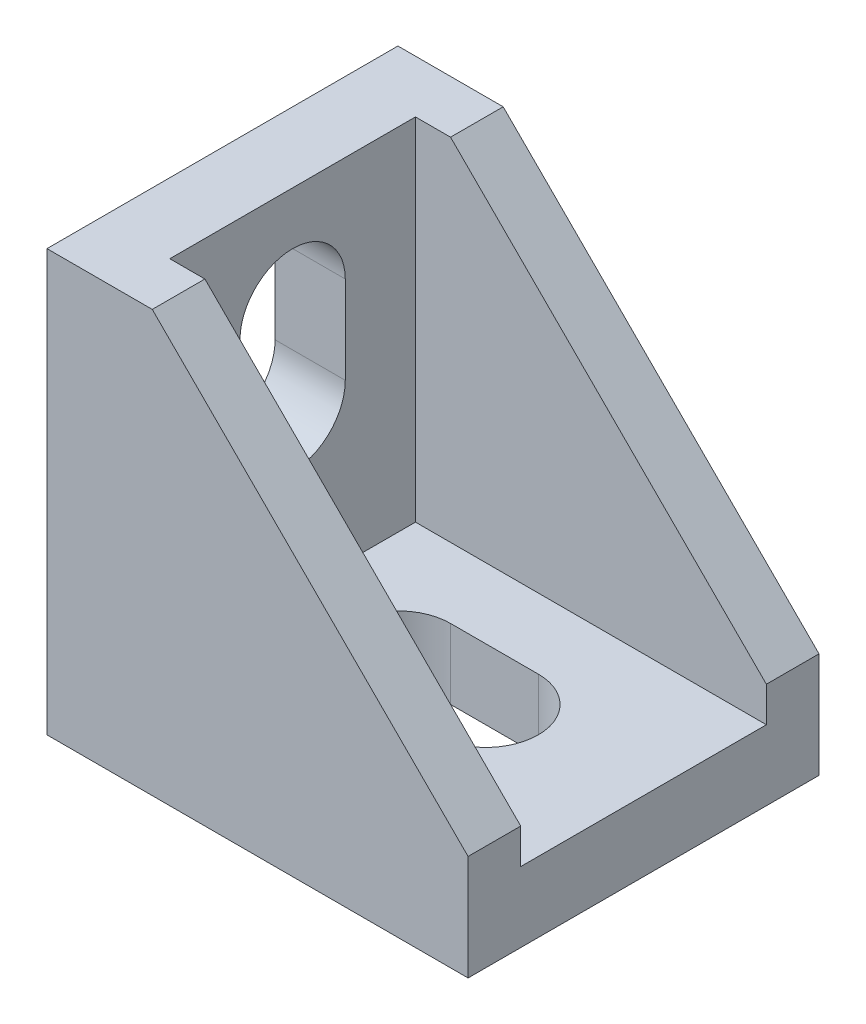
ISO-10303-21;
HEADER;
FILE_DESCRIPTION(('STEP AP214'),'2;1');
FILE_NAME('part.step','',(''),(''),'','','');
FILE_SCHEMA(('AUTOMOTIVE_DESIGN { 1 0 10303 214 1 1 1 1 }'));
ENDSEC;
DATA;
#1=APPLICATION_CONTEXT('core data for automotive mechanical design processes');
#2=APPLICATION_PROTOCOL_DEFINITION('international standard','automotive_design',2000,#1);
#3=PRODUCT_CONTEXT('',#1,'mechanical');
#4=PRODUCT('Part','Part','',(#3));
#5=PRODUCT_RELATED_PRODUCT_CATEGORY('part','',(#4));
#6=PRODUCT_DEFINITION_FORMATION('','',#4);
#7=PRODUCT_DEFINITION_CONTEXT('part definition',#1,'design');
#8=PRODUCT_DEFINITION('design','',#6,#7);
#9=PRODUCT_DEFINITION_SHAPE('','',#8);
#10=(LENGTH_UNIT() NAMED_UNIT(*) SI_UNIT(.MILLI.,.METRE.));
#11=(NAMED_UNIT(*) PLANE_ANGLE_UNIT() SI_UNIT($,.RADIAN.));
#12=(NAMED_UNIT(*) SI_UNIT($,.STERADIAN.) SOLID_ANGLE_UNIT());
#13=UNCERTAINTY_MEASURE_WITH_UNIT(LENGTH_MEASURE(1.E-05),#10,'distance_accuracy_value','');
#14=(GEOMETRIC_REPRESENTATION_CONTEXT(3) GLOBAL_UNCERTAINTY_ASSIGNED_CONTEXT((#13)) GLOBAL_UNIT_ASSIGNED_CONTEXT((#10,
#11,#12)) REPRESENTATION_CONTEXT('',''));
#15=CARTESIAN_POINT('',(0.,0.,0.));
#16=DIRECTION('',(0.,0.,1.));
#17=DIRECTION('',(1.,0.,0.));
#18=AXIS2_PLACEMENT_3D('',#15,#16,#17);
#19=CARTESIAN_POINT('',(24.,6.,20.));
#20=DIRECTION('',(-0.707106781186548,-0.707106781186548,0.));
#21=DIRECTION('',(0.707106781186548,-0.707106781186548,0.));
#22=AXIS2_PLACEMENT_3D('',#19,#20,#21);
#23=PLANE('',#22);
#24=DIRECTION('',(-0.707106781186548,0.707106781186548,0.));
#25=VECTOR('',#24,1.);
#26=CARTESIAN_POINT('',(24.,6.,3.));
#27=LINE('',#26,#25);
#28=CARTESIAN_POINT('',(24.,6.,3.));
#29=VERTEX_POINT('',#28);
#30=CARTESIAN_POINT('',(6.,24.,3.));
#31=VERTEX_POINT('',#30);
#32=EDGE_CURVE('E178',#29,#31,#27,.T.);
#33=ORIENTED_EDGE('',*,*,#32,.F.);
#34=DIRECTION('',(0.,0.,-1.));
#35=VECTOR('',#34,1.);
#36=CARTESIAN_POINT('',(24.,6.,20.));
#37=LINE('',#36,#35);
#38=CARTESIAN_POINT('',(24.,6.,0.));
#39=VERTEX_POINT('',#38);
#40=EDGE_CURVE('E164',#29,#39,#37,.T.);
#41=ORIENTED_EDGE('',*,*,#40,.T.);
#42=DIRECTION('',(-0.707106781186547,0.707106781186547,0.));
#43=VECTOR('',#42,1.);
#44=CARTESIAN_POINT('',(24.,6.,0.));
#45=LINE('',#44,#43);
#46=CARTESIAN_POINT('',(6.,24.,0.));
#47=VERTEX_POINT('',#46);
#48=EDGE_CURVE('E176',#39,#47,#45,.T.);
#49=ORIENTED_EDGE('',*,*,#48,.T.);
#50=DIRECTION('',(0.,0.,-1.));
#51=VECTOR('',#50,1.);
#52=CARTESIAN_POINT('',(6.,24.,20.));
#53=LINE('',#52,#51);
#54=EDGE_CURVE('E195',#31,#47,#53,.T.);
#55=ORIENTED_EDGE('',*,*,#54,.F.);
#56=EDGE_LOOP('',(#33,#41,#49,#55));
#57=FACE_BOUND('',#56,.T.);
#58=ADVANCED_FACE('F39',(#57),#23,.F.);
#59=CARTESIAN_POINT('',(0.,28.,20.));
#60=DIRECTION('',(1.,0.,0.));
#61=DIRECTION('',(0.,1.,0.));
#62=AXIS2_PLACEMENT_3D('',#59,#60,#61);
#63=PLANE('',#62);
#64=DIRECTION('',(0.,1.,0.));
#65=VECTOR('',#64,1.);
#66=CARTESIAN_POINT('',(0.,28.,7.));
#67=LINE('',#66,#65);
#68=CARTESIAN_POINT('',(0.,13.,7.));
#69=VERTEX_POINT('',#68);
#70=CARTESIAN_POINT('',(0.,18.,7.));
#71=VERTEX_POINT('',#70);
#72=EDGE_CURVE('E283',#69,#71,#67,.T.);
#73=ORIENTED_EDGE('',*,*,#72,.T.);
#74=CARTESIAN_POINT('',(0.,18.,10.));
#75=DIRECTION('',(1.,0.,0.));
#76=DIRECTION('',(0.,1.,0.));
#77=AXIS2_PLACEMENT_3D('',#74,#75,#76);
#78=CIRCLE('',#77,3.);
#79=CARTESIAN_POINT('',(0.,18.,13.));
#80=VERTEX_POINT('',#79);
#81=EDGE_CURVE('E286',#71,#80,#78,.T.);
#82=ORIENTED_EDGE('',*,*,#81,.T.);
#83=DIRECTION('',(0.,-1.,0.));
#84=VECTOR('',#83,1.);
#85=CARTESIAN_POINT('',(0.,28.,13.));
#86=LINE('',#85,#84);
#87=CARTESIAN_POINT('',(0.,13.,13.));
#88=VERTEX_POINT('',#87);
#89=EDGE_CURVE('E271',#80,#88,#86,.T.);
#90=ORIENTED_EDGE('',*,*,#89,.T.);
#91=CARTESIAN_POINT('',(0.,13.,10.));
#92=DIRECTION('',(1.,0.,0.));
#93=DIRECTION('',(0.,1.,0.));
#94=AXIS2_PLACEMENT_3D('',#91,#92,#93);
#95=CIRCLE('',#94,3.);
#96=EDGE_CURVE('E280',#88,#69,#95,.T.);
#97=ORIENTED_EDGE('',*,*,#96,.T.);
#98=EDGE_LOOP('',(#73,#82,#90,#97));
#99=FACE_BOUND('',#98,.T.);
#100=DIRECTION('',(0.,-1.,0.));
#101=VECTOR('',#100,1.);
#102=CARTESIAN_POINT('',(0.,28.,20.));
#103=LINE('',#102,#101);
#104=CARTESIAN_POINT('',(0.,24.,20.));
#105=VERTEX_POINT('',#104);
#106=CARTESIAN_POINT('',(0.,0.,20.));
#107=VERTEX_POINT('',#106);
#108=EDGE_CURVE('E186',#105,#107,#103,.T.);
#109=ORIENTED_EDGE('',*,*,#108,.F.);
#110=DIRECTION('',(0.,0.,-1.));
#111=VECTOR('',#110,1.);
#112=CARTESIAN_POINT('',(0.,24.,30.));
#113=LINE('',#112,#111);
#114=CARTESIAN_POINT('',(0.,24.,0.));
#115=VERTEX_POINT('',#114);
#116=EDGE_CURVE('E241',#105,#115,#113,.T.);
#117=ORIENTED_EDGE('',*,*,#116,.T.);
#118=DIRECTION('',(0.,-1.,0.));
#119=VECTOR('',#118,1.);
#120=CARTESIAN_POINT('',(0.,28.,0.));
#121=LINE('',#120,#119);
#122=CARTESIAN_POINT('',(0.,0.,0.));
#123=VERTEX_POINT('',#122);
#124=EDGE_CURVE('E191',#115,#123,#121,.T.);
#125=ORIENTED_EDGE('',*,*,#124,.T.);
#126=DIRECTION('',(0.,0.,-1.));
#127=VECTOR('',#126,1.);
#128=CARTESIAN_POINT('',(0.,0.,20.));
#129=LINE('',#128,#127);
#130=EDGE_CURVE('E198',#107,#123,#129,.T.);
#131=ORIENTED_EDGE('',*,*,#130,.F.);
#132=EDGE_LOOP('',(#109,#117,#125,#131));
#133=FACE_BOUND('',#132,.T.);
#134=ADVANCED_FACE('F41',(#99,#133),#63,.F.);
#135=CARTESIAN_POINT('',(0.,0.,20.));
#136=DIRECTION('',(0.,1.,0.));
#137=DIRECTION('',(0.,0.,1.));
#138=AXIS2_PLACEMENT_3D('',#135,#136,#137);
#139=PLANE('',#138);
#140=DIRECTION('',(-1.,0.,0.));
#141=VECTOR('',#140,1.);
#142=CARTESIAN_POINT('',(0.,0.,7.));
#143=LINE('',#142,#141);
#144=CARTESIAN_POINT('',(15.,0.,7.));
#145=VERTEX_POINT('',#144);
#146=CARTESIAN_POINT('',(10.,0.,7.));
#147=VERTEX_POINT('',#146);
#148=EDGE_CURVE('E221',#145,#147,#143,.T.);
#149=ORIENTED_EDGE('',*,*,#148,.T.);
#150=CARTESIAN_POINT('',(10.,0.,10.));
#151=DIRECTION('',(0.,1.,0.));
#152=DIRECTION('',(0.,0.,1.));
#153=AXIS2_PLACEMENT_3D('',#150,#151,#152);
#154=CIRCLE('',#153,3.);
#155=CARTESIAN_POINT('',(10.,0.,13.));
#156=VERTEX_POINT('',#155);
#157=EDGE_CURVE('E217',#147,#156,#154,.T.);
#158=ORIENTED_EDGE('',*,*,#157,.T.);
#159=DIRECTION('',(1.,0.,0.));
#160=VECTOR('',#159,1.);
#161=CARTESIAN_POINT('',(0.,0.,13.));
#162=LINE('',#161,#160);
#163=CARTESIAN_POINT('',(15.,0.,13.));
#164=VERTEX_POINT('',#163);
#165=EDGE_CURVE('E303',#156,#164,#162,.T.);
#166=ORIENTED_EDGE('',*,*,#165,.T.);
#167=CARTESIAN_POINT('',(15.,0.,10.));
#168=DIRECTION('',(0.,1.,0.));
#169=DIRECTION('',(0.,0.,1.));
#170=AXIS2_PLACEMENT_3D('',#167,#168,#169);
#171=CIRCLE('',#170,3.);
#172=EDGE_CURVE('E312',#164,#145,#171,.T.);
#173=ORIENTED_EDGE('',*,*,#172,.T.);
#174=EDGE_LOOP('',(#149,#158,#166,#173));
#175=FACE_BOUND('',#174,.T.);
#176=DIRECTION('',(1.,0.,0.));
#177=VECTOR('',#176,1.);
#178=CARTESIAN_POINT('',(0.,0.,0.));
#179=LINE('',#178,#177);
#180=CARTESIAN_POINT('',(24.,0.,0.));
#181=VERTEX_POINT('',#180);
#182=EDGE_CURVE('E187',#123,#181,#179,.T.);
#183=ORIENTED_EDGE('',*,*,#182,.T.);
#184=DIRECTION('',(0.,0.,-1.));
#185=VECTOR('',#184,1.);
#186=CARTESIAN_POINT('',(24.,0.,30.));
#187=LINE('',#186,#185);
#188=CARTESIAN_POINT('',(24.,0.,20.));
#189=VERTEX_POINT('',#188);
#190=EDGE_CURVE('E166',#189,#181,#187,.T.);
#191=ORIENTED_EDGE('',*,*,#190,.F.);
#192=DIRECTION('',(1.,0.,0.));
#193=VECTOR('',#192,1.);
#194=CARTESIAN_POINT('',(0.,0.,20.));
#195=LINE('',#194,#193);
#196=EDGE_CURVE('E189',#107,#189,#195,.T.);
#197=ORIENTED_EDGE('',*,*,#196,.F.);
#198=ORIENTED_EDGE('',*,*,#130,.T.);
#199=EDGE_LOOP('',(#183,#191,#197,#198));
#200=FACE_BOUND('',#199,.T.);
#201=ADVANCED_FACE('F243',(#175,#200),#139,.F.);
#202=CARTESIAN_POINT('',(24.,6.,20.));
#203=VERTEX_POINT('',#202);
#204=CARTESIAN_POINT('',(24.,6.,17.));
#205=VERTEX_POINT('',#204);
#206=EDGE_CURVE('E179',#203,#205,#37,.T.);
#207=ORIENTED_EDGE('',*,*,#206,.T.);
#208=DIRECTION('',(-0.707106781186548,0.707106781186548,0.));
#209=VECTOR('',#208,1.);
#210=CARTESIAN_POINT('',(24.,6.,17.));
#211=LINE('',#210,#209);
#212=CARTESIAN_POINT('',(6.,24.,17.));
#213=VERTEX_POINT('',#212);
#214=EDGE_CURVE('E229',#205,#213,#211,.T.);
#215=ORIENTED_EDGE('',*,*,#214,.T.);
#216=CARTESIAN_POINT('',(6.,24.,20.));
#217=VERTEX_POINT('',#216);
#218=EDGE_CURVE('E180',#217,#213,#53,.T.);
#219=ORIENTED_EDGE('',*,*,#218,.F.);
#220=DIRECTION('',(-0.707106781186547,0.707106781186547,0.));
#221=VECTOR('',#220,1.);
#222=CARTESIAN_POINT('',(24.,6.,20.));
#223=LINE('',#222,#221);
#224=EDGE_CURVE('E234',#203,#217,#223,.T.);
#225=ORIENTED_EDGE('',*,*,#224,.F.);
#226=EDGE_LOOP('',(#207,#215,#219,#225));
#227=FACE_BOUND('',#226,.T.);
#228=ADVANCED_FACE('F344',(#227),#23,.F.);
#229=CARTESIAN_POINT('',(0.,0.,20.));
#230=DIRECTION('',(0.,0.,1.));
#231=DIRECTION('',(1.,0.,0.));
#232=AXIS2_PLACEMENT_3D('',#229,#230,#231);
#233=PLANE('',#232);
#234=DIRECTION('',(0.,-1.,0.));
#235=VECTOR('',#234,1.);
#236=CARTESIAN_POINT('',(24.,0.,20.));
#237=LINE('',#236,#235);
#238=EDGE_CURVE('E247',#203,#189,#237,.T.);
#239=ORIENTED_EDGE('',*,*,#238,.F.);
#240=ORIENTED_EDGE('',*,*,#224,.T.);
#241=DIRECTION('',(1.,0.,0.));
#242=VECTOR('',#241,1.);
#243=CARTESIAN_POINT('',(0.,24.,20.));
#244=LINE('',#243,#242);
#245=EDGE_CURVE('E250',#105,#217,#244,.T.);
#246=ORIENTED_EDGE('',*,*,#245,.F.);
#247=ORIENTED_EDGE('',*,*,#108,.T.);
#248=ORIENTED_EDGE('',*,*,#196,.T.);
#249=EDGE_LOOP('',(#239,#240,#246,#247,#248));
#250=FACE_BOUND('',#249,.T.);
#251=ADVANCED_FACE('F246',(#250),#233,.T.);
#252=CARTESIAN_POINT('',(0.,0.,0.));
#253=DIRECTION('',(0.,0.,1.));
#254=DIRECTION('',(1.,0.,0.));
#255=AXIS2_PLACEMENT_3D('',#252,#253,#254);
#256=PLANE('',#255);
#257=ORIENTED_EDGE('',*,*,#48,.F.);
#258=DIRECTION('',(0.,1.,0.));
#259=VECTOR('',#258,1.);
#260=CARTESIAN_POINT('',(24.,6.,0.));
#261=LINE('',#260,#259);
#262=EDGE_CURVE('E161',#181,#39,#261,.T.);
#263=ORIENTED_EDGE('',*,*,#262,.F.);
#264=ORIENTED_EDGE('',*,*,#182,.F.);
#265=ORIENTED_EDGE('',*,*,#124,.F.);
#266=DIRECTION('',(-1.,0.,0.));
#267=VECTOR('',#266,1.);
#268=CARTESIAN_POINT('',(0.,24.,0.));
#269=LINE('',#268,#267);
#270=EDGE_CURVE('E185',#47,#115,#269,.T.);
#271=ORIENTED_EDGE('',*,*,#270,.F.);
#272=EDGE_LOOP('',(#257,#263,#264,#265,#271));
#273=FACE_BOUND('',#272,.T.);
#274=ADVANCED_FACE('F183',(#273),#256,.F.);
#275=CARTESIAN_POINT('',(0.,0.,3.));
#276=DIRECTION('',(0.,0.,1.));
#277=DIRECTION('',(1.,0.,0.));
#278=AXIS2_PLACEMENT_3D('',#275,#276,#277);
#279=PLANE('',#278);
#280=DIRECTION('',(0.,-1.,0.));
#281=VECTOR('',#280,1.);
#282=CARTESIAN_POINT('',(24.,0.,3.));
#283=LINE('',#282,#281);
#284=CARTESIAN_POINT('',(24.,4.,3.));
#285=VERTEX_POINT('',#284);
#286=EDGE_CURVE('E54',#29,#285,#283,.T.);
#287=ORIENTED_EDGE('',*,*,#286,.F.);
#288=ORIENTED_EDGE('',*,*,#32,.T.);
#289=DIRECTION('',(1.,0.,0.));
#290=VECTOR('',#289,1.);
#291=CARTESIAN_POINT('',(0.,24.,3.));
#292=LINE('',#291,#290);
#293=CARTESIAN_POINT('',(4.,24.,3.));
#294=VERTEX_POINT('',#293);
#295=EDGE_CURVE('E253',#294,#31,#292,.T.);
#296=ORIENTED_EDGE('',*,*,#295,.F.);
#297=DIRECTION('',(0.,-1.,0.));
#298=VECTOR('',#297,1.);
#299=CARTESIAN_POINT('',(4.,28.,3.));
#300=LINE('',#299,#298);
#301=CARTESIAN_POINT('',(4.,4.,3.));
#302=VERTEX_POINT('',#301);
#303=EDGE_CURVE('E207',#294,#302,#300,.T.);
#304=ORIENTED_EDGE('',*,*,#303,.T.);
#305=DIRECTION('',(1.,0.,0.));
#306=VECTOR('',#305,1.);
#307=CARTESIAN_POINT('',(4.,4.,3.));
#308=LINE('',#307,#306);
#309=EDGE_CURVE('E224',#302,#285,#308,.T.);
#310=ORIENTED_EDGE('',*,*,#309,.T.);
#311=EDGE_LOOP('',(#287,#288,#296,#304,#310));
#312=FACE_BOUND('',#311,.T.);
#313=ADVANCED_FACE('F319',(#312),#279,.T.);
#314=CARTESIAN_POINT('',(0.,0.,17.));
#315=DIRECTION('',(0.,0.,1.));
#316=DIRECTION('',(1.,0.,0.));
#317=AXIS2_PLACEMENT_3D('',#314,#315,#316);
#318=PLANE('',#317);
#319=ORIENTED_EDGE('',*,*,#214,.F.);
#320=DIRECTION('',(0.,-1.,0.));
#321=VECTOR('',#320,1.);
#322=CARTESIAN_POINT('',(24.,0.,17.));
#323=LINE('',#322,#321);
#324=CARTESIAN_POINT('',(24.,4.,17.));
#325=VERTEX_POINT('',#324);
#326=EDGE_CURVE('E322',#205,#325,#323,.T.);
#327=ORIENTED_EDGE('',*,*,#326,.T.);
#328=DIRECTION('',(1.,0.,0.));
#329=VECTOR('',#328,1.);
#330=CARTESIAN_POINT('',(4.,4.,17.));
#331=LINE('',#330,#329);
#332=CARTESIAN_POINT('',(4.,4.,17.));
#333=VERTEX_POINT('',#332);
#334=EDGE_CURVE('E216',#333,#325,#331,.T.);
#335=ORIENTED_EDGE('',*,*,#334,.F.);
#336=DIRECTION('',(0.,-1.,0.));
#337=VECTOR('',#336,1.);
#338=CARTESIAN_POINT('',(4.,28.,17.));
#339=LINE('',#338,#337);
#340=CARTESIAN_POINT('',(4.,24.,17.));
#341=VERTEX_POINT('',#340);
#342=EDGE_CURVE('E205',#341,#333,#339,.T.);
#343=ORIENTED_EDGE('',*,*,#342,.F.);
#344=DIRECTION('',(1.,0.,0.));
#345=VECTOR('',#344,1.);
#346=CARTESIAN_POINT('',(0.,24.,17.));
#347=LINE('',#346,#345);
#348=EDGE_CURVE('E61',#341,#213,#347,.T.);
#349=ORIENTED_EDGE('',*,*,#348,.T.);
#350=EDGE_LOOP('',(#319,#327,#335,#343,#349));
#351=FACE_BOUND('',#350,.T.);
#352=ADVANCED_FACE('F212',(#351),#318,.F.);
#353=CARTESIAN_POINT('',(4.,4.,3.));
#354=DIRECTION('',(0.,-1.,0.));
#355=DIRECTION('',(0.,0.,-1.));
#356=AXIS2_PLACEMENT_3D('',#353,#354,#355);
#357=PLANE('',#356);
#358=DIRECTION('',(1.,0.,0.));
#359=VECTOR('',#358,1.);
#360=CARTESIAN_POINT('',(10.,4.,13.));
#361=LINE('',#360,#359);
#362=CARTESIAN_POINT('',(10.,4.,13.));
#363=VERTEX_POINT('',#362);
#364=CARTESIAN_POINT('',(15.,4.,13.));
#365=VERTEX_POINT('',#364);
#366=EDGE_CURVE('E291',#363,#365,#361,.T.);
#367=ORIENTED_EDGE('',*,*,#366,.F.);
#368=CARTESIAN_POINT('',(10.,4.,10.));
#369=DIRECTION('',(0.,1.,0.));
#370=DIRECTION('',(0.,0.,-1.));
#371=AXIS2_PLACEMENT_3D('',#368,#369,#370);
#372=CIRCLE('',#371,3.);
#373=CARTESIAN_POINT('',(10.,4.,7.));
#374=VERTEX_POINT('',#373);
#375=EDGE_CURVE('E289',#374,#363,#372,.T.);
#376=ORIENTED_EDGE('',*,*,#375,.F.);
#377=DIRECTION('',(-1.,0.,0.));
#378=VECTOR('',#377,1.);
#379=CARTESIAN_POINT('',(10.,4.,7.));
#380=LINE('',#379,#378);
#381=CARTESIAN_POINT('',(15.,4.,7.));
#382=VERTEX_POINT('',#381);
#383=EDGE_CURVE('E297',#382,#374,#380,.T.);
#384=ORIENTED_EDGE('',*,*,#383,.F.);
#385=CARTESIAN_POINT('',(15.,4.,10.));
#386=DIRECTION('',(0.,1.,0.));
#387=DIRECTION('',(0.,0.,1.));
#388=AXIS2_PLACEMENT_3D('',#385,#386,#387);
#389=CIRCLE('',#388,3.);
#390=EDGE_CURVE('E294',#365,#382,#389,.T.);
#391=ORIENTED_EDGE('',*,*,#390,.F.);
#392=EDGE_LOOP('',(#367,#376,#384,#391));
#393=FACE_BOUND('',#392,.T.);
#394=ORIENTED_EDGE('',*,*,#334,.T.);
#395=DIRECTION('',(0.,0.,-1.));
#396=VECTOR('',#395,1.);
#397=CARTESIAN_POINT('',(24.,4.,3.));
#398=LINE('',#397,#396);
#399=EDGE_CURVE('E11',#325,#285,#398,.T.);
#400=ORIENTED_EDGE('',*,*,#399,.T.);
#401=ORIENTED_EDGE('',*,*,#309,.F.);
#402=DIRECTION('',(0.,0.,1.));
#403=VECTOR('',#402,1.);
#404=CARTESIAN_POINT('',(4.,4.,3.));
#405=LINE('',#404,#403);
#406=EDGE_CURVE('E227',#302,#333,#405,.T.);
#407=ORIENTED_EDGE('',*,*,#406,.T.);
#408=EDGE_LOOP('',(#394,#400,#401,#407));
#409=FACE_BOUND('',#408,.T.);
#410=ADVANCED_FACE('F321',(#393,#409),#357,.F.);
#411=CARTESIAN_POINT('',(4.,28.,3.));
#412=DIRECTION('',(-1.,0.,0.));
#413=DIRECTION('',(0.,-1.,0.));
#414=AXIS2_PLACEMENT_3D('',#411,#412,#413);
#415=PLANE('',#414);
#416=DIRECTION('',(0.,-1.,0.));
#417=VECTOR('',#416,1.);
#418=CARTESIAN_POINT('',(4.,18.,13.));
#419=LINE('',#418,#417);
#420=CARTESIAN_POINT('',(4.,18.,13.));
#421=VERTEX_POINT('',#420);
#422=CARTESIAN_POINT('',(4.,13.,13.));
#423=VERTEX_POINT('',#422);
#424=EDGE_CURVE('E255',#421,#423,#419,.T.);
#425=ORIENTED_EDGE('',*,*,#424,.F.);
#426=CARTESIAN_POINT('',(4.,18.,10.));
#427=DIRECTION('',(1.,0.,0.));
#428=DIRECTION('',(0.,-1.,0.));
#429=AXIS2_PLACEMENT_3D('',#426,#427,#428);
#430=CIRCLE('',#429,3.);
#431=CARTESIAN_POINT('',(4.,18.,7.));
#432=VERTEX_POINT('',#431);
#433=EDGE_CURVE('E252',#432,#421,#430,.T.);
#434=ORIENTED_EDGE('',*,*,#433,.F.);
#435=DIRECTION('',(0.,1.,0.));
#436=VECTOR('',#435,1.);
#437=CARTESIAN_POINT('',(4.,18.,7.));
#438=LINE('',#437,#436);
#439=CARTESIAN_POINT('',(4.,13.,7.));
#440=VERTEX_POINT('',#439);
#441=EDGE_CURVE('E265',#440,#432,#438,.T.);
#442=ORIENTED_EDGE('',*,*,#441,.F.);
#443=CARTESIAN_POINT('',(4.,13.,10.));
#444=DIRECTION('',(1.,0.,0.));
#445=DIRECTION('',(0.,1.,0.));
#446=AXIS2_PLACEMENT_3D('',#443,#444,#445);
#447=CIRCLE('',#446,3.);
#448=EDGE_CURVE('E262',#423,#440,#447,.T.);
#449=ORIENTED_EDGE('',*,*,#448,.F.);
#450=EDGE_LOOP('',(#425,#434,#442,#449));
#451=FACE_BOUND('',#450,.T.);
#452=ORIENTED_EDGE('',*,*,#303,.F.);
#453=DIRECTION('',(0.,0.,1.));
#454=VECTOR('',#453,1.);
#455=CARTESIAN_POINT('',(4.,24.,3.));
#456=LINE('',#455,#454);
#457=EDGE_CURVE('E47',#294,#341,#456,.T.);
#458=ORIENTED_EDGE('',*,*,#457,.T.);
#459=ORIENTED_EDGE('',*,*,#342,.T.);
#460=ORIENTED_EDGE('',*,*,#406,.F.);
#461=EDGE_LOOP('',(#452,#458,#459,#460));
#462=FACE_BOUND('',#461,.T.);
#463=ADVANCED_FACE('F203',(#451,#462),#415,.F.);
#464=CARTESIAN_POINT('',(10.,-8.,10.));
#465=DIRECTION('',(0.,1.,0.));
#466=DIRECTION('',(0.,0.,1.));
#467=AXIS2_PLACEMENT_3D('',#464,#465,#466);
#468=CYLINDRICAL_SURFACE('',#467,3.);
#469=DIRECTION('',(0.,1.,0.));
#470=VECTOR('',#469,1.);
#471=CARTESIAN_POINT('',(10.,-8.,7.));
#472=LINE('',#471,#470);
#473=EDGE_CURVE('E301',#147,#374,#472,.T.);
#474=ORIENTED_EDGE('',*,*,#473,.T.);
#475=ORIENTED_EDGE('',*,*,#375,.T.);
#476=DIRECTION('',(0.,1.,0.));
#477=VECTOR('',#476,1.);
#478=CARTESIAN_POINT('',(10.,-8.,13.));
#479=LINE('',#478,#477);
#480=EDGE_CURVE('E300',#156,#363,#479,.T.);
#481=ORIENTED_EDGE('',*,*,#480,.F.);
#482=ORIENTED_EDGE('',*,*,#157,.F.);
#483=EDGE_LOOP('',(#474,#475,#481,#482));
#484=FACE_BOUND('',#483,.T.);
#485=ADVANCED_FACE('F375',(#484),#468,.F.);
#486=CARTESIAN_POINT('',(10.,-8.,7.));
#487=DIRECTION('',(0.,0.,-1.));
#488=DIRECTION('',(-1.,0.,0.));
#489=AXIS2_PLACEMENT_3D('',#486,#487,#488);
#490=PLANE('',#489);
#491=DIRECTION('',(0.,1.,0.));
#492=VECTOR('',#491,1.);
#493=CARTESIAN_POINT('',(15.,-8.,7.));
#494=LINE('',#493,#492);
#495=EDGE_CURVE('E304',#145,#382,#494,.T.);
#496=ORIENTED_EDGE('',*,*,#495,.T.);
#497=ORIENTED_EDGE('',*,*,#383,.T.);
#498=ORIENTED_EDGE('',*,*,#473,.F.);
#499=ORIENTED_EDGE('',*,*,#148,.F.);
#500=EDGE_LOOP('',(#496,#497,#498,#499));
#501=FACE_BOUND('',#500,.T.);
#502=ADVANCED_FACE('F365',(#501),#490,.F.);
#503=CARTESIAN_POINT('',(15.,-8.,10.));
#504=DIRECTION('',(0.,1.,0.));
#505=DIRECTION('',(0.,0.,1.));
#506=AXIS2_PLACEMENT_3D('',#503,#504,#505);
#507=CYLINDRICAL_SURFACE('',#506,3.);
#508=DIRECTION('',(0.,1.,0.));
#509=VECTOR('',#508,1.);
#510=CARTESIAN_POINT('',(15.,-8.,13.));
#511=LINE('',#510,#509);
#512=EDGE_CURVE('E306',#164,#365,#511,.T.);
#513=ORIENTED_EDGE('',*,*,#512,.T.);
#514=ORIENTED_EDGE('',*,*,#390,.T.);
#515=ORIENTED_EDGE('',*,*,#495,.F.);
#516=ORIENTED_EDGE('',*,*,#172,.F.);
#517=EDGE_LOOP('',(#513,#514,#515,#516));
#518=FACE_BOUND('',#517,.T.);
#519=ADVANCED_FACE('F367',(#518),#507,.F.);
#520=CARTESIAN_POINT('',(10.,-8.,13.));
#521=DIRECTION('',(0.,0.,1.));
#522=DIRECTION('',(1.,0.,0.));
#523=AXIS2_PLACEMENT_3D('',#520,#521,#522);
#524=PLANE('',#523);
#525=ORIENTED_EDGE('',*,*,#480,.T.);
#526=ORIENTED_EDGE('',*,*,#366,.T.);
#527=ORIENTED_EDGE('',*,*,#512,.F.);
#528=ORIENTED_EDGE('',*,*,#165,.F.);
#529=EDGE_LOOP('',(#525,#526,#527,#528));
#530=FACE_BOUND('',#529,.T.);
#531=ADVANCED_FACE('F377',(#530),#524,.F.);
#532=CARTESIAN_POINT('',(-8.,18.,10.));
#533=DIRECTION('',(1.,0.,0.));
#534=DIRECTION('',(0.,1.,0.));
#535=AXIS2_PLACEMENT_3D('',#532,#533,#534);
#536=CYLINDRICAL_SURFACE('',#535,3.);
#537=DIRECTION('',(1.,0.,0.));
#538=VECTOR('',#537,1.);
#539=CARTESIAN_POINT('',(-8.,18.,7.));
#540=LINE('',#539,#538);
#541=EDGE_CURVE('E269',#71,#432,#540,.T.);
#542=ORIENTED_EDGE('',*,*,#541,.T.);
#543=ORIENTED_EDGE('',*,*,#433,.T.);
#544=DIRECTION('',(1.,0.,0.));
#545=VECTOR('',#544,1.);
#546=CARTESIAN_POINT('',(-8.,18.,13.));
#547=LINE('',#546,#545);
#548=EDGE_CURVE('E268',#80,#421,#547,.T.);
#549=ORIENTED_EDGE('',*,*,#548,.F.);
#550=ORIENTED_EDGE('',*,*,#81,.F.);
#551=EDGE_LOOP('',(#542,#543,#549,#550));
#552=FACE_BOUND('',#551,.T.);
#553=ADVANCED_FACE('F379',(#552),#536,.F.);
#554=CARTESIAN_POINT('',(-8.,18.,7.));
#555=DIRECTION('',(0.,0.,-1.));
#556=DIRECTION('',(-1.,0.,0.));
#557=AXIS2_PLACEMENT_3D('',#554,#555,#556);
#558=PLANE('',#557);
#559=DIRECTION('',(1.,0.,0.));
#560=VECTOR('',#559,1.);
#561=CARTESIAN_POINT('',(-8.,13.,7.));
#562=LINE('',#561,#560);
#563=EDGE_CURVE('E272',#69,#440,#562,.T.);
#564=ORIENTED_EDGE('',*,*,#563,.T.);
#565=ORIENTED_EDGE('',*,*,#441,.T.);
#566=ORIENTED_EDGE('',*,*,#541,.F.);
#567=ORIENTED_EDGE('',*,*,#72,.F.);
#568=EDGE_LOOP('',(#564,#565,#566,#567));
#569=FACE_BOUND('',#568,.T.);
#570=ADVANCED_FACE('F385',(#569),#558,.F.);
#571=CARTESIAN_POINT('',(-8.,13.,10.));
#572=DIRECTION('',(1.,0.,0.));
#573=DIRECTION('',(0.,1.,0.));
#574=AXIS2_PLACEMENT_3D('',#571,#572,#573);
#575=CYLINDRICAL_SURFACE('',#574,3.);
#576=DIRECTION('',(1.,0.,0.));
#577=VECTOR('',#576,1.);
#578=CARTESIAN_POINT('',(-8.,13.,13.));
#579=LINE('',#578,#577);
#580=EDGE_CURVE('E274',#88,#423,#579,.T.);
#581=ORIENTED_EDGE('',*,*,#580,.T.);
#582=ORIENTED_EDGE('',*,*,#448,.T.);
#583=ORIENTED_EDGE('',*,*,#563,.F.);
#584=ORIENTED_EDGE('',*,*,#96,.F.);
#585=EDGE_LOOP('',(#581,#582,#583,#584));
#586=FACE_BOUND('',#585,.T.);
#587=ADVANCED_FACE('F338',(#586),#575,.F.);
#588=CARTESIAN_POINT('',(-8.,18.,13.));
#589=DIRECTION('',(0.,0.,1.));
#590=DIRECTION('',(1.,0.,0.));
#591=AXIS2_PLACEMENT_3D('',#588,#589,#590);
#592=PLANE('',#591);
#593=ORIENTED_EDGE('',*,*,#548,.T.);
#594=ORIENTED_EDGE('',*,*,#424,.T.);
#595=ORIENTED_EDGE('',*,*,#580,.F.);
#596=ORIENTED_EDGE('',*,*,#89,.F.);
#597=EDGE_LOOP('',(#593,#594,#595,#596));
#598=FACE_BOUND('',#597,.T.);
#599=ADVANCED_FACE('F331',(#598),#592,.F.);
#600=CARTESIAN_POINT('',(0.,24.,30.));
#601=DIRECTION('',(0.,-1.,0.));
#602=DIRECTION('',(0.,0.,-1.));
#603=AXIS2_PLACEMENT_3D('',#600,#601,#602);
#604=PLANE('',#603);
#605=ORIENTED_EDGE('',*,*,#245,.T.);
#606=ORIENTED_EDGE('',*,*,#218,.T.);
#607=ORIENTED_EDGE('',*,*,#348,.F.);
#608=ORIENTED_EDGE('',*,*,#457,.F.);
#609=ORIENTED_EDGE('',*,*,#295,.T.);
#610=ORIENTED_EDGE('',*,*,#54,.T.);
#611=ORIENTED_EDGE('',*,*,#270,.T.);
#612=ORIENTED_EDGE('',*,*,#116,.F.);
#613=EDGE_LOOP('',(#605,#606,#607,#608,#609,#610,#611,#612));
#614=FACE_BOUND('',#613,.T.);
#615=ADVANCED_FACE('F329',(#614),#604,.F.);
#616=CARTESIAN_POINT('',(24.,6.,30.));
#617=DIRECTION('',(-1.,0.,0.));
#618=DIRECTION('',(0.,0.,1.));
#619=AXIS2_PLACEMENT_3D('',#616,#617,#618);
#620=PLANE('',#619);
#621=ORIENTED_EDGE('',*,*,#238,.T.);
#622=ORIENTED_EDGE('',*,*,#190,.T.);
#623=ORIENTED_EDGE('',*,*,#262,.T.);
#624=ORIENTED_EDGE('',*,*,#40,.F.);
#625=ORIENTED_EDGE('',*,*,#286,.T.);
#626=ORIENTED_EDGE('',*,*,#399,.F.);
#627=ORIENTED_EDGE('',*,*,#326,.F.);
#628=ORIENTED_EDGE('',*,*,#206,.F.);
#629=EDGE_LOOP('',(#621,#622,#623,#624,#625,#626,#627,#628));
#630=FACE_BOUND('',#629,.T.);
#631=ADVANCED_FACE('F163',(#630),#620,.F.);
#632=CLOSED_SHELL('',(#58,#134,#201,#228,#251,#274,#313,#352,#410,#463,#485,#502,#519,#531,#553,
#570,#587,#599,#615,#631));
#633=MANIFOLD_SOLID_BREP('B2',#632);
#634=ADVANCED_BREP_SHAPE_REPRESENTATION('',(#18,#633),#14);
#635=SHAPE_DEFINITION_REPRESENTATION(#9,#634);
ENDSEC;
END-ISO-10303-21;
